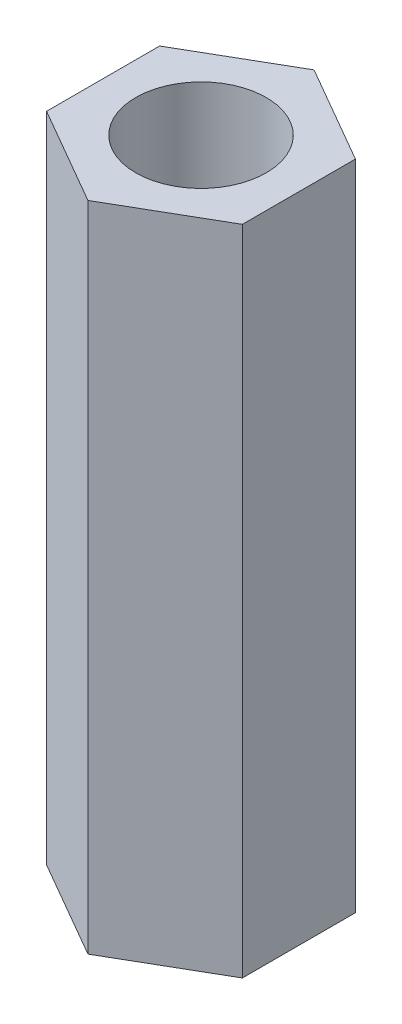
ISO-10303-21;
HEADER;
FILE_DESCRIPTION(('STEP AP214'),'2;1');
FILE_NAME('part.step','',(''),(''),'','','');
FILE_SCHEMA(('AUTOMOTIVE_DESIGN { 1 0 10303 214 1 1 1 1 }'));
ENDSEC;
DATA;
#1=APPLICATION_CONTEXT('core data for automotive mechanical design processes');
#2=APPLICATION_PROTOCOL_DEFINITION('international standard','automotive_design',2000,#1);
#3=PRODUCT_CONTEXT('',#1,'mechanical');
#4=PRODUCT('Part','Part','',(#3));
#5=PRODUCT_RELATED_PRODUCT_CATEGORY('part','',(#4));
#6=PRODUCT_DEFINITION_FORMATION('','',#4);
#7=PRODUCT_DEFINITION_CONTEXT('part definition',#1,'design');
#8=PRODUCT_DEFINITION('design','',#6,#7);
#9=PRODUCT_DEFINITION_SHAPE('','',#8);
#10=(LENGTH_UNIT() NAMED_UNIT(*) SI_UNIT(.MILLI.,.METRE.));
#11=(NAMED_UNIT(*) PLANE_ANGLE_UNIT() SI_UNIT($,.RADIAN.));
#12=(NAMED_UNIT(*) SI_UNIT($,.STERADIAN.) SOLID_ANGLE_UNIT());
#13=UNCERTAINTY_MEASURE_WITH_UNIT(LENGTH_MEASURE(1.E-05),#10,'distance_accuracy_value','');
#14=(GEOMETRIC_REPRESENTATION_CONTEXT(3) GLOBAL_UNCERTAINTY_ASSIGNED_CONTEXT((#13)) GLOBAL_UNIT_ASSIGNED_CONTEXT((#10,
#11,#12)) REPRESENTATION_CONTEXT('',''));
#15=CARTESIAN_POINT('',(0.,0.,0.));
#16=DIRECTION('',(0.,0.,1.));
#17=DIRECTION('',(1.,0.,0.));
#18=AXIS2_PLACEMENT_3D('',#15,#16,#17);
#19=CARTESIAN_POINT('',(2.24999999999998,15.,-1.29903810567668));
#20=DIRECTION('',(-0.499999999999995,0.,0.866025403784441));
#21=DIRECTION('',(0.866025403784442,0.,0.499999999999995));
#22=AXIS2_PLACEMENT_3D('',#19,#20,#21);
#23=PLANE('',#22);
#24=DIRECTION('',(-0.866025403784441,0.,-0.499999999999995));
#25=VECTOR('',#24,1.);
#26=CARTESIAN_POINT('',(2.24999999999998,0.,-1.29903810567668));
#27=LINE('',#26,#25);
#28=CARTESIAN_POINT('',(2.24999999999998,0.,-1.29903810567668));
#29=VERTEX_POINT('',#28);
#30=CARTESIAN_POINT('',(0.,0.,-2.59807621135331));
#31=VERTEX_POINT('',#30);
#32=EDGE_CURVE('E116',#29,#31,#27,.T.);
#33=ORIENTED_EDGE('',*,*,#32,.T.);
#34=DIRECTION('',(0.,-1.,0.));
#35=VECTOR('',#34,1.);
#36=CARTESIAN_POINT('',(0.,15.,-2.59807621135331));
#37=LINE('',#36,#35);
#38=CARTESIAN_POINT('',(0.,15.,-2.59807621135331));
#39=VERTEX_POINT('',#38);
#40=EDGE_CURVE('E11',#39,#31,#37,.T.);
#41=ORIENTED_EDGE('',*,*,#40,.F.);
#42=DIRECTION('',(-0.866025403784441,0.,-0.499999999999995));
#43=VECTOR('',#42,1.);
#44=CARTESIAN_POINT('',(2.24999999999998,15.,-1.29903810567668));
#45=LINE('',#44,#43);
#46=CARTESIAN_POINT('',(2.24999999999998,15.,-1.29903810567668));
#47=VERTEX_POINT('',#46);
#48=EDGE_CURVE('E127',#47,#39,#45,.T.);
#49=ORIENTED_EDGE('',*,*,#48,.F.);
#50=DIRECTION('',(0.,-1.,0.));
#51=VECTOR('',#50,1.);
#52=CARTESIAN_POINT('',(2.24999999999998,15.,-1.29903810567668));
#53=LINE('',#52,#51);
#54=EDGE_CURVE('E112',#47,#29,#53,.T.);
#55=ORIENTED_EDGE('',*,*,#54,.T.);
#56=EDGE_LOOP('',(#33,#41,#49,#55));
#57=FACE_BOUND('',#56,.T.);
#58=ADVANCED_FACE('F32',(#57),#23,.F.);
#59=CARTESIAN_POINT('',(0.,15.,-2.59807621135331));
#60=DIRECTION('',(0.500000000000001,0.,0.866025403784438));
#61=DIRECTION('',(0.866025403784438,0.,-0.500000000000001));
#62=AXIS2_PLACEMENT_3D('',#59,#60,#61);
#63=PLANE('',#62);
#64=DIRECTION('',(-0.866025403784438,0.,0.500000000000001));
#65=VECTOR('',#64,1.);
#66=CARTESIAN_POINT('',(0.,0.,-2.59807621135331));
#67=LINE('',#66,#65);
#68=CARTESIAN_POINT('',(-2.25,0.,-1.29903810567665));
#69=VERTEX_POINT('',#68);
#70=EDGE_CURVE('E119',#31,#69,#67,.T.);
#71=ORIENTED_EDGE('',*,*,#70,.T.);
#72=DIRECTION('',(0.,-1.,0.));
#73=VECTOR('',#72,1.);
#74=CARTESIAN_POINT('',(-2.25,15.,-1.29903810567665));
#75=LINE('',#74,#73);
#76=CARTESIAN_POINT('',(-2.25,15.,-1.29903810567665));
#77=VERTEX_POINT('',#76);
#78=EDGE_CURVE('E40',#77,#69,#75,.T.);
#79=ORIENTED_EDGE('',*,*,#78,.F.);
#80=DIRECTION('',(-0.866025403784438,0.,0.500000000000001));
#81=VECTOR('',#80,1.);
#82=CARTESIAN_POINT('',(0.,15.,-2.59807621135331));
#83=LINE('',#82,#81);
#84=EDGE_CURVE('E85',#39,#77,#83,.T.);
#85=ORIENTED_EDGE('',*,*,#84,.F.);
#86=ORIENTED_EDGE('',*,*,#40,.T.);
#87=EDGE_LOOP('',(#71,#79,#85,#86));
#88=FACE_BOUND('',#87,.T.);
#89=ADVANCED_FACE('F152',(#88),#63,.F.);
#90=CARTESIAN_POINT('',(-2.25,15.,-1.29903810567665));
#91=DIRECTION('',(1.,0.,0.));
#92=DIRECTION('',(0.,0.,-1.));
#93=AXIS2_PLACEMENT_3D('',#90,#91,#92);
#94=PLANE('',#93);
#95=DIRECTION('',(0.,0.,1.));
#96=VECTOR('',#95,1.);
#97=CARTESIAN_POINT('',(-2.25,0.,-1.29903810567665));
#98=LINE('',#97,#96);
#99=CARTESIAN_POINT('',(-2.24999999999999,0.,1.29903810567667));
#100=VERTEX_POINT('',#99);
#101=EDGE_CURVE('E122',#69,#100,#98,.T.);
#102=ORIENTED_EDGE('',*,*,#101,.T.);
#103=DIRECTION('',(0.,-1.,0.));
#104=VECTOR('',#103,1.);
#105=CARTESIAN_POINT('',(-2.24999999999999,15.,1.29903810567667));
#106=LINE('',#105,#104);
#107=CARTESIAN_POINT('',(-2.24999999999999,15.,1.29903810567667));
#108=VERTEX_POINT('',#107);
#109=EDGE_CURVE('E107',#108,#100,#106,.T.);
#110=ORIENTED_EDGE('',*,*,#109,.F.);
#111=DIRECTION('',(0.,0.,1.));
#112=VECTOR('',#111,1.);
#113=CARTESIAN_POINT('',(-2.25,15.,-1.29903810567665));
#114=LINE('',#113,#112);
#115=EDGE_CURVE('E98',#77,#108,#114,.T.);
#116=ORIENTED_EDGE('',*,*,#115,.F.);
#117=ORIENTED_EDGE('',*,*,#78,.T.);
#118=EDGE_LOOP('',(#102,#110,#116,#117));
#119=FACE_BOUND('',#118,.T.);
#120=ADVANCED_FACE('F133',(#119),#94,.F.);
#121=CARTESIAN_POINT('',(-2.24999999999999,15.,1.29903810567667));
#122=DIRECTION('',(0.499999999999995,0.,-0.866025403784441));
#123=DIRECTION('',(-0.866025403784441,0.,-0.499999999999995));
#124=AXIS2_PLACEMENT_3D('',#121,#122,#123);
#125=PLANE('',#124);
#126=DIRECTION('',(0.866025403784441,0.,0.499999999999995));
#127=VECTOR('',#126,1.);
#128=CARTESIAN_POINT('',(-2.24999999999999,0.,1.29903810567667));
#129=LINE('',#128,#127);
#130=CARTESIAN_POINT('',(0.,0.,2.59807621135331));
#131=VERTEX_POINT('',#130);
#132=EDGE_CURVE('E106',#100,#131,#129,.T.);
#133=ORIENTED_EDGE('',*,*,#132,.T.);
#134=DIRECTION('',(0.,-1.,0.));
#135=VECTOR('',#134,1.);
#136=CARTESIAN_POINT('',(0.,15.,2.59807621135331));
#137=LINE('',#136,#135);
#138=CARTESIAN_POINT('',(0.,15.,2.59807621135331));
#139=VERTEX_POINT('',#138);
#140=EDGE_CURVE('E103',#139,#131,#137,.T.);
#141=ORIENTED_EDGE('',*,*,#140,.F.);
#142=DIRECTION('',(0.866025403784441,0.,0.499999999999995));
#143=VECTOR('',#142,1.);
#144=CARTESIAN_POINT('',(-2.24999999999999,15.,1.29903810567667));
#145=LINE('',#144,#143);
#146=EDGE_CURVE('E92',#108,#139,#145,.T.);
#147=ORIENTED_EDGE('',*,*,#146,.F.);
#148=ORIENTED_EDGE('',*,*,#109,.T.);
#149=EDGE_LOOP('',(#133,#141,#147,#148));
#150=FACE_BOUND('',#149,.T.);
#151=ADVANCED_FACE('F104',(#150),#125,.F.);
#152=CARTESIAN_POINT('',(0.,15.,2.59807621135331));
#153=DIRECTION('',(-0.500000000000007,0.,-0.866025403784435));
#154=DIRECTION('',(-0.866025403784435,0.,0.500000000000007));
#155=AXIS2_PLACEMENT_3D('',#152,#153,#154);
#156=PLANE('',#155);
#157=DIRECTION('',(0.866025403784434,0.,-0.500000000000007));
#158=VECTOR('',#157,1.);
#159=CARTESIAN_POINT('',(0.,0.,2.59807621135331));
#160=LINE('',#159,#158);
#161=CARTESIAN_POINT('',(2.25000000000001,0.,1.29903810567663));
#162=VERTEX_POINT('',#161);
#163=EDGE_CURVE('E71',#131,#162,#160,.T.);
#164=ORIENTED_EDGE('',*,*,#163,.T.);
#165=DIRECTION('',(0.,-1.,0.));
#166=VECTOR('',#165,1.);
#167=CARTESIAN_POINT('',(2.25000000000001,15.,1.29903810567663));
#168=LINE('',#167,#166);
#169=CARTESIAN_POINT('',(2.25000000000001,15.,1.29903810567663));
#170=VERTEX_POINT('',#169);
#171=EDGE_CURVE('E108',#170,#162,#168,.T.);
#172=ORIENTED_EDGE('',*,*,#171,.F.);
#173=DIRECTION('',(0.866025403784434,0.,-0.500000000000007));
#174=VECTOR('',#173,1.);
#175=CARTESIAN_POINT('',(0.,15.,2.59807621135331));
#176=LINE('',#175,#174);
#177=EDGE_CURVE('E96',#139,#170,#176,.T.);
#178=ORIENTED_EDGE('',*,*,#177,.F.);
#179=ORIENTED_EDGE('',*,*,#140,.T.);
#180=EDGE_LOOP('',(#164,#172,#178,#179));
#181=FACE_BOUND('',#180,.T.);
#182=ADVANCED_FACE('F110',(#181),#156,.F.);
#183=CARTESIAN_POINT('',(2.25000000000001,15.,1.29903810567663));
#184=DIRECTION('',(-1.,0.,0.));
#185=DIRECTION('',(0.,0.,1.));
#186=AXIS2_PLACEMENT_3D('',#183,#184,#185);
#187=PLANE('',#186);
#188=DIRECTION('',(0.,0.,-1.));
#189=VECTOR('',#188,1.);
#190=CARTESIAN_POINT('',(2.25000000000001,0.,1.29903810567663));
#191=LINE('',#190,#189);
#192=EDGE_CURVE('E77',#162,#29,#191,.T.);
#193=ORIENTED_EDGE('',*,*,#192,.T.);
#194=ORIENTED_EDGE('',*,*,#54,.F.);
#195=DIRECTION('',(0.,0.,-1.));
#196=VECTOR('',#195,1.);
#197=CARTESIAN_POINT('',(2.25000000000001,15.,1.29903810567663));
#198=LINE('',#197,#196);
#199=EDGE_CURVE('E48',#170,#47,#198,.T.);
#200=ORIENTED_EDGE('',*,*,#199,.F.);
#201=ORIENTED_EDGE('',*,*,#171,.T.);
#202=EDGE_LOOP('',(#193,#194,#200,#201));
#203=FACE_BOUND('',#202,.T.);
#204=ADVANCED_FACE('F140',(#203),#187,.F.);
#205=CARTESIAN_POINT('',(0.,15.,0.));
#206=DIRECTION('',(0.,1.,0.));
#207=DIRECTION('',(0.,0.,1.));
#208=AXIS2_PLACEMENT_3D('',#205,#206,#207);
#209=PLANE('',#208);
#210=CARTESIAN_POINT('',(0.,15.,0.));
#211=DIRECTION('',(0.,1.,0.));
#212=DIRECTION('',(0.,0.,1.));
#213=AXIS2_PLACEMENT_3D('',#210,#211,#212);
#214=CIRCLE('',#213,1.5);
#215=CARTESIAN_POINT('',(0.,15.,1.5));
#216=VERTEX_POINT('',#215);
#217=EDGE_CURVE('E207',#216,#216,#214,.T.);
#218=ORIENTED_EDGE('',*,*,#217,.F.);
#219=EDGE_LOOP('',(#218));
#220=FACE_BOUND('',#219,.T.);
#221=ORIENTED_EDGE('',*,*,#48,.T.);
#222=ORIENTED_EDGE('',*,*,#84,.T.);
#223=ORIENTED_EDGE('',*,*,#115,.T.);
#224=ORIENTED_EDGE('',*,*,#146,.T.);
#225=ORIENTED_EDGE('',*,*,#177,.T.);
#226=ORIENTED_EDGE('',*,*,#199,.T.);
#227=EDGE_LOOP('',(#221,#222,#223,#224,#225,#226));
#228=FACE_BOUND('',#227,.T.);
#229=ADVANCED_FACE('F94',(#220,#228),#209,.T.);
#230=CARTESIAN_POINT('',(0.,0.,0.));
#231=DIRECTION('',(0.,1.,0.));
#232=DIRECTION('',(0.,0.,1.));
#233=AXIS2_PLACEMENT_3D('',#230,#231,#232);
#234=PLANE('',#233);
#235=CARTESIAN_POINT('',(0.,0.,0.));
#236=DIRECTION('',(0.,1.,0.));
#237=DIRECTION('',(0.,0.,1.));
#238=AXIS2_PLACEMENT_3D('',#235,#236,#237);
#239=CIRCLE('',#238,1.5);
#240=CARTESIAN_POINT('',(0.,0.,1.5));
#241=VERTEX_POINT('',#240);
#242=EDGE_CURVE('E120',#241,#241,#239,.T.);
#243=ORIENTED_EDGE('',*,*,#242,.T.);
#244=EDGE_LOOP('',(#243));
#245=FACE_BOUND('',#244,.T.);
#246=ORIENTED_EDGE('',*,*,#32,.F.);
#247=ORIENTED_EDGE('',*,*,#192,.F.);
#248=ORIENTED_EDGE('',*,*,#163,.F.);
#249=ORIENTED_EDGE('',*,*,#132,.F.);
#250=ORIENTED_EDGE('',*,*,#101,.F.);
#251=ORIENTED_EDGE('',*,*,#70,.F.);
#252=EDGE_LOOP('',(#246,#247,#248,#249,#250,#251));
#253=FACE_BOUND('',#252,.T.);
#254=ADVANCED_FACE('F136',(#245,#253),#234,.F.);
#255=CARTESIAN_POINT('',(0.,0.,0.));
#256=DIRECTION('',(0.,1.,0.));
#257=DIRECTION('',(0.,0.,1.));
#258=AXIS2_PLACEMENT_3D('',#255,#256,#257);
#259=CYLINDRICAL_SURFACE('',#258,1.5);
#260=ORIENTED_EDGE('',*,*,#242,.F.);
#261=EDGE_LOOP('',(#260));
#262=FACE_BOUND('',#261,.T.);
#263=ORIENTED_EDGE('',*,*,#217,.T.);
#264=EDGE_LOOP('',(#263));
#265=FACE_BOUND('',#264,.T.);
#266=ADVANCED_FACE('F189',(#262,#265),#259,.F.);
#267=CLOSED_SHELL('',(#58,#89,#120,#151,#182,#204,#229,#254,#266));
#268=MANIFOLD_SOLID_BREP('B2',#267);
#269=ADVANCED_BREP_SHAPE_REPRESENTATION('',(#18,#268),#14);
#270=SHAPE_DEFINITION_REPRESENTATION(#9,#269);
ENDSEC;
END-ISO-10303-21;
